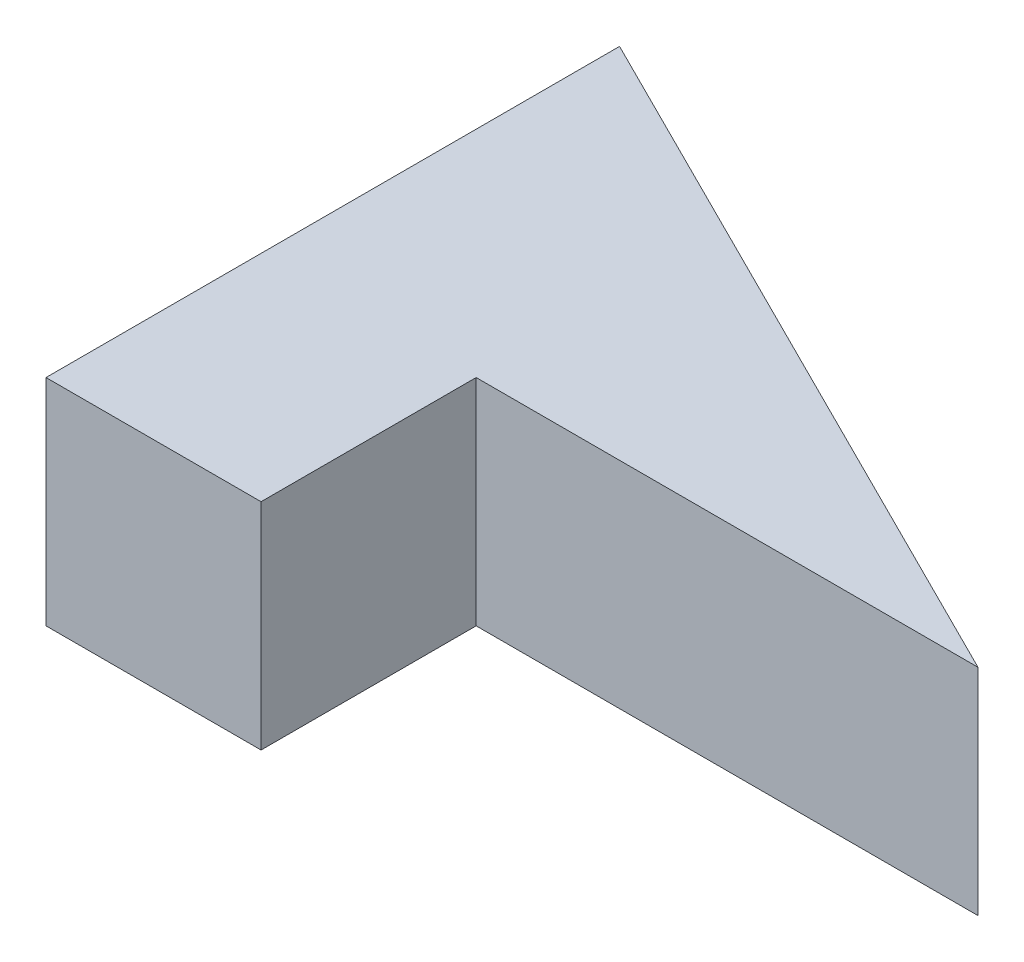
ISO-10303-21;
HEADER;
FILE_DESCRIPTION(('STEP AP214'),'2;1');
FILE_NAME('part.step','',(''),(''),'','','');
FILE_SCHEMA(('AUTOMOTIVE_DESIGN { 1 0 10303 214 1 1 1 1 }'));
ENDSEC;
DATA;
#1=APPLICATION_CONTEXT('core data for automotive mechanical design processes');
#2=APPLICATION_PROTOCOL_DEFINITION('international standard','automotive_design',2000,#1);
#3=PRODUCT_CONTEXT('',#1,'mechanical');
#4=PRODUCT('Part','Part','',(#3));
#5=PRODUCT_RELATED_PRODUCT_CATEGORY('part','',(#4));
#6=PRODUCT_DEFINITION_FORMATION('','',#4);
#7=PRODUCT_DEFINITION_CONTEXT('part definition',#1,'design');
#8=PRODUCT_DEFINITION('design','',#6,#7);
#9=PRODUCT_DEFINITION_SHAPE('','',#8);
#10=(LENGTH_UNIT() NAMED_UNIT(*) SI_UNIT(.MILLI.,.METRE.));
#11=(NAMED_UNIT(*) PLANE_ANGLE_UNIT() SI_UNIT($,.RADIAN.));
#12=(NAMED_UNIT(*) SI_UNIT($,.STERADIAN.) SOLID_ANGLE_UNIT());
#13=UNCERTAINTY_MEASURE_WITH_UNIT(LENGTH_MEASURE(1.E-05),#10,'distance_accuracy_value','');
#14=(GEOMETRIC_REPRESENTATION_CONTEXT(3) GLOBAL_UNCERTAINTY_ASSIGNED_CONTEXT((#13)) GLOBAL_UNIT_ASSIGNED_CONTEXT((#10,
#11,#12)) REPRESENTATION_CONTEXT('',''));
#15=CARTESIAN_POINT('',(0.,0.,0.));
#16=DIRECTION('',(0.,0.,1.));
#17=DIRECTION('',(1.,0.,0.));
#18=AXIS2_PLACEMENT_3D('',#15,#16,#17);
#19=CARTESIAN_POINT('',(0.,3.,3.));
#20=DIRECTION('',(0.,0.,-1.));
#21=DIRECTION('',(-1.,0.,0.));
#22=AXIS2_PLACEMENT_3D('',#19,#20,#21);
#23=PLANE('',#22);
#24=DIRECTION('',(1.,0.,0.));
#25=VECTOR('',#24,1.);
#26=CARTESIAN_POINT('',(0.,0.,3.));
#27=LINE('',#26,#25);
#28=CARTESIAN_POINT('',(0.,0.,3.));
#29=VERTEX_POINT('',#28);
#30=CARTESIAN_POINT('',(3.,0.,3.));
#31=VERTEX_POINT('',#30);
#32=EDGE_CURVE('E111',#29,#31,#27,.T.);
#33=ORIENTED_EDGE('',*,*,#32,.T.);
#34=DIRECTION('',(0.,-1.,0.));
#35=VECTOR('',#34,1.);
#36=CARTESIAN_POINT('',(3.,3.,3.));
#37=LINE('',#36,#35);
#38=CARTESIAN_POINT('',(3.,3.,3.));
#39=VERTEX_POINT('',#38);
#40=EDGE_CURVE('E41',#39,#31,#37,.T.);
#41=ORIENTED_EDGE('',*,*,#40,.F.);
#42=DIRECTION('',(1.,0.,0.));
#43=VECTOR('',#42,1.);
#44=CARTESIAN_POINT('',(0.,3.,3.));
#45=LINE('',#44,#43);
#46=CARTESIAN_POINT('',(0.,3.,3.));
#47=VERTEX_POINT('',#46);
#48=EDGE_CURVE('E84',#47,#39,#45,.T.);
#49=ORIENTED_EDGE('',*,*,#48,.F.);
#50=DIRECTION('',(0.,-1.,0.));
#51=VECTOR('',#50,1.);
#52=CARTESIAN_POINT('',(0.,3.,3.));
#53=LINE('',#52,#51);
#54=EDGE_CURVE('E11',#47,#29,#53,.T.);
#55=ORIENTED_EDGE('',*,*,#54,.T.);
#56=EDGE_LOOP('',(#33,#41,#49,#55));
#57=FACE_BOUND('',#56,.T.);
#58=ADVANCED_FACE('F33',(#57),#23,.F.);
#59=CARTESIAN_POINT('',(3.,3.,3.));
#60=DIRECTION('',(-1.,0.,0.));
#61=DIRECTION('',(0.,0.,1.));
#62=AXIS2_PLACEMENT_3D('',#59,#60,#61);
#63=PLANE('',#62);
#64=DIRECTION('',(0.,0.,-1.));
#65=VECTOR('',#64,1.);
#66=CARTESIAN_POINT('',(3.,0.,3.));
#67=LINE('',#66,#65);
#68=CARTESIAN_POINT('',(3.,0.,0.));
#69=VERTEX_POINT('',#68);
#70=EDGE_CURVE('E100',#31,#69,#67,.T.);
#71=ORIENTED_EDGE('',*,*,#70,.T.);
#72=DIRECTION('',(0.,-1.,0.));
#73=VECTOR('',#72,1.);
#74=CARTESIAN_POINT('',(3.,3.,0.));
#75=LINE('',#74,#73);
#76=CARTESIAN_POINT('',(3.,3.,0.));
#77=VERTEX_POINT('',#76);
#78=EDGE_CURVE('E97',#77,#69,#75,.T.);
#79=ORIENTED_EDGE('',*,*,#78,.F.);
#80=DIRECTION('',(0.,0.,-1.));
#81=VECTOR('',#80,1.);
#82=CARTESIAN_POINT('',(3.,3.,3.));
#83=LINE('',#82,#81);
#84=EDGE_CURVE('E89',#39,#77,#83,.T.);
#85=ORIENTED_EDGE('',*,*,#84,.F.);
#86=ORIENTED_EDGE('',*,*,#40,.T.);
#87=EDGE_LOOP('',(#71,#79,#85,#86));
#88=FACE_BOUND('',#87,.T.);
#89=ADVANCED_FACE('F98',(#88),#63,.F.);
#90=CARTESIAN_POINT('',(3.,3.,0.));
#91=DIRECTION('',(0.,0.,-1.));
#92=DIRECTION('',(-1.,0.,0.));
#93=AXIS2_PLACEMENT_3D('',#90,#91,#92);
#94=PLANE('',#93);
#95=DIRECTION('',(1.,0.,0.));
#96=VECTOR('',#95,1.);
#97=CARTESIAN_POINT('',(3.,0.,0.));
#98=LINE('',#97,#96);
#99=CARTESIAN_POINT('',(10.,0.,0.));
#100=VERTEX_POINT('',#99);
#101=EDGE_CURVE('E70',#69,#100,#98,.T.);
#102=ORIENTED_EDGE('',*,*,#101,.T.);
#103=DIRECTION('',(0.,-1.,0.));
#104=VECTOR('',#103,1.);
#105=CARTESIAN_POINT('',(10.,3.,0.));
#106=LINE('',#105,#104);
#107=CARTESIAN_POINT('',(10.,3.,0.));
#108=VERTEX_POINT('',#107);
#109=EDGE_CURVE('E101',#108,#100,#106,.T.);
#110=ORIENTED_EDGE('',*,*,#109,.F.);
#111=DIRECTION('',(1.,0.,0.));
#112=VECTOR('',#111,1.);
#113=CARTESIAN_POINT('',(3.,3.,0.));
#114=LINE('',#113,#112);
#115=EDGE_CURVE('E93',#77,#108,#114,.T.);
#116=ORIENTED_EDGE('',*,*,#115,.F.);
#117=ORIENTED_EDGE('',*,*,#78,.T.);
#118=EDGE_LOOP('',(#102,#110,#116,#117));
#119=FACE_BOUND('',#118,.T.);
#120=ADVANCED_FACE('F103',(#119),#94,.F.);
#121=CARTESIAN_POINT('',(10.,3.,0.));
#122=DIRECTION('',(-0.447213595499954,0.,0.894427190999918));
#123=DIRECTION('',(0.894427190999918,0.,0.447213595499954));
#124=AXIS2_PLACEMENT_3D('',#121,#122,#123);
#125=PLANE('',#124);
#126=DIRECTION('',(-0.894427190999918,0.,-0.447213595499954));
#127=VECTOR('',#126,1.);
#128=CARTESIAN_POINT('',(10.,0.,0.));
#129=LINE('',#128,#127);
#130=CARTESIAN_POINT('',(0.,0.,-4.99999999999995));
#131=VERTEX_POINT('',#130);
#132=EDGE_CURVE('E77',#100,#131,#129,.T.);
#133=ORIENTED_EDGE('',*,*,#132,.T.);
#134=DIRECTION('',(0.,-1.,0.));
#135=VECTOR('',#134,1.);
#136=CARTESIAN_POINT('',(0.,3.,-4.99999999999995));
#137=LINE('',#136,#135);
#138=CARTESIAN_POINT('',(0.,3.,-4.99999999999995));
#139=VERTEX_POINT('',#138);
#140=EDGE_CURVE('E107',#139,#131,#137,.T.);
#141=ORIENTED_EDGE('',*,*,#140,.F.);
#142=DIRECTION('',(-0.894427190999918,0.,-0.447213595499954));
#143=VECTOR('',#142,1.);
#144=CARTESIAN_POINT('',(10.,3.,0.));
#145=LINE('',#144,#143);
#146=EDGE_CURVE('E105',#108,#139,#145,.T.);
#147=ORIENTED_EDGE('',*,*,#146,.F.);
#148=ORIENTED_EDGE('',*,*,#109,.T.);
#149=EDGE_LOOP('',(#133,#141,#147,#148));
#150=FACE_BOUND('',#149,.T.);
#151=ADVANCED_FACE('F124',(#150),#125,.F.);
#152=CARTESIAN_POINT('',(0.,3.,-4.99999999999995));
#153=DIRECTION('',(1.,0.,0.));
#154=DIRECTION('',(0.,0.,-1.));
#155=AXIS2_PLACEMENT_3D('',#152,#153,#154);
#156=PLANE('',#155);
#157=DIRECTION('',(0.,0.,1.));
#158=VECTOR('',#157,1.);
#159=CARTESIAN_POINT('',(0.,0.,-4.99999999999995));
#160=LINE('',#159,#158);
#161=EDGE_CURVE('E116',#131,#29,#160,.T.);
#162=ORIENTED_EDGE('',*,*,#161,.T.);
#163=ORIENTED_EDGE('',*,*,#54,.F.);
#164=DIRECTION('',(0.,0.,1.));
#165=VECTOR('',#164,1.);
#166=CARTESIAN_POINT('',(0.,3.,0.));
#167=LINE('',#166,#165);
#168=EDGE_CURVE('E49',#139,#47,#167,.T.);
#169=ORIENTED_EDGE('',*,*,#168,.F.);
#170=ORIENTED_EDGE('',*,*,#140,.T.);
#171=EDGE_LOOP('',(#162,#163,#169,#170));
#172=FACE_BOUND('',#171,.T.);
#173=ADVANCED_FACE('F123',(#172),#156,.F.);
#174=CARTESIAN_POINT('',(0.,3.,0.));
#175=DIRECTION('',(0.,1.,0.));
#176=DIRECTION('',(0.,0.,1.));
#177=AXIS2_PLACEMENT_3D('',#174,#175,#176);
#178=PLANE('',#177);
#179=ORIENTED_EDGE('',*,*,#168,.T.);
#180=ORIENTED_EDGE('',*,*,#48,.T.);
#181=ORIENTED_EDGE('',*,*,#84,.T.);
#182=ORIENTED_EDGE('',*,*,#115,.T.);
#183=ORIENTED_EDGE('',*,*,#146,.T.);
#184=EDGE_LOOP('',(#179,#180,#181,#182,#183));
#185=FACE_BOUND('',#184,.T.);
#186=ADVANCED_FACE('F91',(#185),#178,.T.);
#187=CARTESIAN_POINT('',(0.,0.,0.));
#188=DIRECTION('',(0.,1.,0.));
#189=DIRECTION('',(0.,0.,1.));
#190=AXIS2_PLACEMENT_3D('',#187,#188,#189);
#191=PLANE('',#190);
#192=ORIENTED_EDGE('',*,*,#32,.F.);
#193=ORIENTED_EDGE('',*,*,#161,.F.);
#194=ORIENTED_EDGE('',*,*,#132,.F.);
#195=ORIENTED_EDGE('',*,*,#101,.F.);
#196=ORIENTED_EDGE('',*,*,#70,.F.);
#197=EDGE_LOOP('',(#192,#193,#194,#195,#196));
#198=FACE_BOUND('',#197,.T.);
#199=ADVANCED_FACE('F121',(#198),#191,.F.);
#200=CLOSED_SHELL('',(#58,#89,#120,#151,#173,#186,#199));
#201=MANIFOLD_SOLID_BREP('B2',#200);
#202=ADVANCED_BREP_SHAPE_REPRESENTATION('',(#18,#201),#14);
#203=SHAPE_DEFINITION_REPRESENTATION(#9,#202);
ENDSEC;
END-ISO-10303-21;
